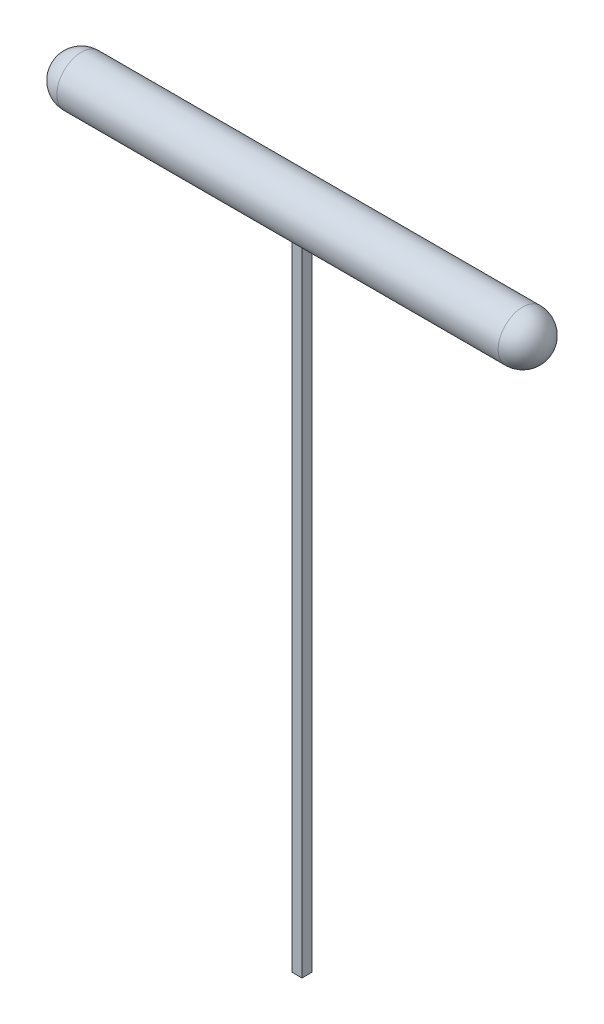
ISO-10303-21;
HEADER;
FILE_DESCRIPTION(('STEP AP214'),'2;1');
FILE_NAME('part.step','',(''),(''),'','','');
FILE_SCHEMA(('AUTOMOTIVE_DESIGN { 1 0 10303 214 1 1 1 1 }'));
ENDSEC;
DATA;
#1=APPLICATION_CONTEXT('core data for automotive mechanical design processes');
#2=APPLICATION_PROTOCOL_DEFINITION('international standard','automotive_design',2000,#1);
#3=PRODUCT_CONTEXT('',#1,'mechanical');
#4=PRODUCT('Part','Part','',(#3));
#5=PRODUCT_RELATED_PRODUCT_CATEGORY('part','',(#4));
#6=PRODUCT_DEFINITION_FORMATION('','',#4);
#7=PRODUCT_DEFINITION_CONTEXT('part definition',#1,'design');
#8=PRODUCT_DEFINITION('design','',#6,#7);
#9=PRODUCT_DEFINITION_SHAPE('','',#8);
#10=(LENGTH_UNIT() NAMED_UNIT(*) SI_UNIT(.MILLI.,.METRE.));
#11=(NAMED_UNIT(*) PLANE_ANGLE_UNIT() SI_UNIT($,.RADIAN.));
#12=(NAMED_UNIT(*) SI_UNIT($,.STERADIAN.) SOLID_ANGLE_UNIT());
#13=UNCERTAINTY_MEASURE_WITH_UNIT(LENGTH_MEASURE(1.E-05),#10,'distance_accuracy_value','');
#14=(GEOMETRIC_REPRESENTATION_CONTEXT(3) GLOBAL_UNCERTAINTY_ASSIGNED_CONTEXT((#13)) GLOBAL_UNIT_ASSIGNED_CONTEXT((#10,
#11,#12)) REPRESENTATION_CONTEXT('',''));
#15=CARTESIAN_POINT('',(0.,0.,0.));
#16=DIRECTION('',(0.,0.,1.));
#17=DIRECTION('',(1.,0.,0.));
#18=AXIS2_PLACEMENT_3D('',#15,#16,#17);
#19=CARTESIAN_POINT('',(0.500000000000008,0.,0.5));
#20=DIRECTION('',(1.,0.,0.));
#21=DIRECTION('',(0.,1.,0.));
#22=AXIS2_PLACEMENT_3D('',#19,#20,#21);
#23=PLANE('',#22);
#24=DIRECTION('',(0.,-1.,0.));
#25=VECTOR('',#24,1.);
#26=CARTESIAN_POINT('',(0.500000000000008,0.,-0.5));
#27=LINE('',#26,#25);
#28=CARTESIAN_POINT('',(0.500000000000007,-2.5,-0.5));
#29=VERTEX_POINT('',#28);
#30=CARTESIAN_POINT('',(0.500000000000001,-67.5,-0.5));
#31=VERTEX_POINT('',#30);
#32=EDGE_CURVE('E114',#29,#31,#27,.T.);
#33=ORIENTED_EDGE('',*,*,#32,.F.);
#34=DIRECTION('',(0.,0.,-1.));
#35=VECTOR('',#34,1.);
#36=CARTESIAN_POINT('',(0.500000000000007,-2.5,0.5));
#37=LINE('',#36,#35);
#38=CARTESIAN_POINT('',(0.500000000000007,-2.5,0.5));
#39=VERTEX_POINT('',#38);
#40=EDGE_CURVE('E12',#39,#29,#37,.T.);
#41=ORIENTED_EDGE('',*,*,#40,.F.);
#42=DIRECTION('',(0.,-1.,0.));
#43=VECTOR('',#42,1.);
#44=CARTESIAN_POINT('',(0.500000000000008,0.,0.5));
#45=LINE('',#44,#43);
#46=CARTESIAN_POINT('',(0.500000000000001,-67.5,0.5));
#47=VERTEX_POINT('',#46);
#48=EDGE_CURVE('E106',#39,#47,#45,.T.);
#49=ORIENTED_EDGE('',*,*,#48,.T.);
#50=DIRECTION('',(0.,0.,-1.));
#51=VECTOR('',#50,1.);
#52=CARTESIAN_POINT('',(0.500000000000001,-67.5,0.5));
#53=LINE('',#52,#51);
#54=EDGE_CURVE('E87',#47,#31,#53,.T.);
#55=ORIENTED_EDGE('',*,*,#54,.T.);
#56=EDGE_LOOP('',(#33,#41,#49,#55));
#57=FACE_BOUND('',#56,.T.);
#58=ADVANCED_FACE('F51',(#57),#23,.T.);
#59=CARTESIAN_POINT('',(0.,-2.5,0.5));
#60=DIRECTION('',(0.,1.,0.));
#61=DIRECTION('',(0.,0.,1.));
#62=AXIS2_PLACEMENT_3D('',#59,#60,#61);
#63=PLANE('',#62);
#64=DIRECTION('',(1.,0.,0.));
#65=VECTOR('',#64,1.);
#66=CARTESIAN_POINT('',(0.,-2.5,-0.5));
#67=LINE('',#66,#65);
#68=CARTESIAN_POINT('',(-0.500000000000007,-2.5,-0.5));
#69=VERTEX_POINT('',#68);
#70=EDGE_CURVE('E105',#69,#29,#67,.T.);
#71=ORIENTED_EDGE('',*,*,#70,.F.);
#72=DIRECTION('',(0.,0.,-1.));
#73=VECTOR('',#72,1.);
#74=CARTESIAN_POINT('',(-0.500000000000007,-2.5,0.5));
#75=LINE('',#74,#73);
#76=CARTESIAN_POINT('',(-0.500000000000007,-2.5,0.5));
#77=VERTEX_POINT('',#76);
#78=EDGE_CURVE('E56',#77,#69,#75,.T.);
#79=ORIENTED_EDGE('',*,*,#78,.F.);
#80=DIRECTION('',(1.,0.,0.));
#81=VECTOR('',#80,1.);
#82=CARTESIAN_POINT('',(0.,-2.5,0.5));
#83=LINE('',#82,#81);
#84=EDGE_CURVE('E99',#77,#39,#83,.T.);
#85=ORIENTED_EDGE('',*,*,#84,.T.);
#86=ORIENTED_EDGE('',*,*,#40,.T.);
#87=EDGE_LOOP('',(#71,#79,#85,#86));
#88=FACE_BOUND('',#87,.T.);
#89=ADVANCED_FACE('F97',(#88),#63,.T.);
#90=CARTESIAN_POINT('',(-0.500000000000008,0.,0.5));
#91=DIRECTION('',(1.,0.,0.));
#92=DIRECTION('',(0.,1.,0.));
#93=AXIS2_PLACEMENT_3D('',#90,#91,#92);
#94=PLANE('',#93);
#95=DIRECTION('',(0.,-1.,0.));
#96=VECTOR('',#95,1.);
#97=CARTESIAN_POINT('',(-0.500000000000008,0.,-0.5));
#98=LINE('',#97,#96);
#99=CARTESIAN_POINT('',(-0.499999999999998,-67.5,-0.5));
#100=VERTEX_POINT('',#99);
#101=EDGE_CURVE('E85',#69,#100,#98,.T.);
#102=ORIENTED_EDGE('',*,*,#101,.T.);
#103=DIRECTION('',(0.,0.,-1.));
#104=VECTOR('',#103,1.);
#105=CARTESIAN_POINT('',(-0.499999999999998,-67.5,0.5));
#106=LINE('',#105,#104);
#107=CARTESIAN_POINT('',(-0.499999999999998,-67.5,0.5));
#108=VERTEX_POINT('',#107);
#109=EDGE_CURVE('E104',#108,#100,#106,.T.);
#110=ORIENTED_EDGE('',*,*,#109,.F.);
#111=DIRECTION('',(0.,-1.,0.));
#112=VECTOR('',#111,1.);
#113=CARTESIAN_POINT('',(-0.500000000000008,0.,0.5));
#114=LINE('',#113,#112);
#115=EDGE_CURVE('E101',#77,#108,#114,.T.);
#116=ORIENTED_EDGE('',*,*,#115,.F.);
#117=ORIENTED_EDGE('',*,*,#78,.T.);
#118=EDGE_LOOP('',(#102,#110,#116,#117));
#119=FACE_BOUND('',#118,.T.);
#120=ADVANCED_FACE('F103',(#119),#94,.F.);
#121=CARTESIAN_POINT('',(0.,-67.5,0.5));
#122=DIRECTION('',(0.,1.,0.));
#123=DIRECTION('',(0.,0.,1.));
#124=AXIS2_PLACEMENT_3D('',#121,#122,#123);
#125=PLANE('',#124);
#126=DIRECTION('',(1.,0.,0.));
#127=VECTOR('',#126,1.);
#128=CARTESIAN_POINT('',(0.,-67.5,-0.5));
#129=LINE('',#128,#127);
#130=EDGE_CURVE('E109',#100,#31,#129,.T.);
#131=ORIENTED_EDGE('',*,*,#130,.T.);
#132=ORIENTED_EDGE('',*,*,#54,.F.);
#133=DIRECTION('',(1.,0.,0.));
#134=VECTOR('',#133,1.);
#135=CARTESIAN_POINT('',(0.,-67.5,0.5));
#136=LINE('',#135,#134);
#137=EDGE_CURVE('E70',#108,#47,#136,.T.);
#138=ORIENTED_EDGE('',*,*,#137,.F.);
#139=ORIENTED_EDGE('',*,*,#109,.T.);
#140=EDGE_LOOP('',(#131,#132,#138,#139));
#141=FACE_BOUND('',#140,.T.);
#142=ADVANCED_FACE('F121',(#141),#125,.F.);
#143=CARTESIAN_POINT('',(0.,0.,0.5));
#144=DIRECTION('',(0.,0.,1.));
#145=DIRECTION('',(1.,0.,0.));
#146=AXIS2_PLACEMENT_3D('',#143,#144,#145);
#147=PLANE('',#146);
#148=ORIENTED_EDGE('',*,*,#48,.F.);
#149=ORIENTED_EDGE('',*,*,#84,.F.);
#150=ORIENTED_EDGE('',*,*,#115,.T.);
#151=ORIENTED_EDGE('',*,*,#137,.T.);
#152=EDGE_LOOP('',(#148,#149,#150,#151));
#153=FACE_BOUND('',#152,.T.);
#154=ADVANCED_FACE('F110',(#153),#147,.T.);
#155=CARTESIAN_POINT('',(0.,0.,-0.5));
#156=DIRECTION('',(0.,0.,1.));
#157=DIRECTION('',(1.,0.,0.));
#158=AXIS2_PLACEMENT_3D('',#155,#156,#157);
#159=PLANE('',#158);
#160=ORIENTED_EDGE('',*,*,#32,.T.);
#161=ORIENTED_EDGE('',*,*,#130,.F.);
#162=ORIENTED_EDGE('',*,*,#101,.F.);
#163=ORIENTED_EDGE('',*,*,#70,.T.);
#164=EDGE_LOOP('',(#160,#161,#162,#163));
#165=FACE_BOUND('',#164,.T.);
#166=ADVANCED_FACE('F124',(#165),#159,.F.);
#167=CLOSED_SHELL('',(#58,#89,#120,#142,#154,#166));
#168=MANIFOLD_SOLID_BREP('B2',#167);
#169=CARTESIAN_POINT('',(22.5,0.,0.));
#170=DIRECTION('',(-1.,0.,0.));
#171=DIRECTION('',(0.,1.,0.));
#172=AXIS2_PLACEMENT_3D('',#169,#170,#171);
#173=SPHERICAL_SURFACE('',#172,2.5);
#174=CARTESIAN_POINT('',(22.5,0.,0.));
#175=DIRECTION('',(-1.,0.,0.));
#176=DIRECTION('',(0.,-1.,0.));
#177=AXIS2_PLACEMENT_3D('',#174,#175,#176);
#178=CIRCLE('',#177,2.5);
#179=CARTESIAN_POINT('',(22.5,-2.5,0.));
#180=VERTEX_POINT('',#179);
#181=EDGE_CURVE('E49',#180,#180,#178,.T.);
#182=ORIENTED_EDGE('',*,*,#181,.F.);
#183=EDGE_LOOP('',(#182));
#184=FACE_BOUND('',#183,.T.);
#185=ADVANCED_FACE('F178',(#184),#173,.T.);
#186=CARTESIAN_POINT('',(-25.,0.,0.));
#187=DIRECTION('',(-1.,0.,0.));
#188=DIRECTION('',(0.,-1.,0.));
#189=AXIS2_PLACEMENT_3D('',#186,#187,#188);
#190=CYLINDRICAL_SURFACE('',#189,2.5);
#191=ORIENTED_EDGE('',*,*,#181,.T.);
#192=EDGE_LOOP('',(#191));
#193=FACE_BOUND('',#192,.T.);
#194=CARTESIAN_POINT('',(-22.5,0.,0.));
#195=DIRECTION('',(-1.,0.,0.));
#196=DIRECTION('',(0.,-1.,0.));
#197=AXIS2_PLACEMENT_3D('',#194,#195,#196);
#198=CIRCLE('',#197,2.5);
#199=CARTESIAN_POINT('',(-22.5,-2.5,0.));
#200=VERTEX_POINT('',#199);
#201=EDGE_CURVE('E182',#200,#200,#198,.T.);
#202=ORIENTED_EDGE('',*,*,#201,.F.);
#203=EDGE_LOOP('',(#202));
#204=FACE_BOUND('',#203,.T.);
#205=ADVANCED_FACE('F195',(#193,#204),#190,.T.);
#206=CARTESIAN_POINT('',(-22.5,0.,0.));
#207=DIRECTION('',(-1.,0.,0.));
#208=DIRECTION('',(0.,1.,0.));
#209=AXIS2_PLACEMENT_3D('',#206,#207,#208);
#210=SPHERICAL_SURFACE('',#209,2.5);
#211=ORIENTED_EDGE('',*,*,#201,.T.);
#212=EDGE_LOOP('',(#211));
#213=FACE_BOUND('',#212,.T.);
#214=ADVANCED_FACE('F189',(#213),#210,.T.);
#215=CLOSED_SHELL('',(#185,#205,#214));
#216=MANIFOLD_SOLID_BREP('B6',#215);
#217=ADVANCED_BREP_SHAPE_REPRESENTATION('',(#18,#168,#216),#14);
#218=SHAPE_DEFINITION_REPRESENTATION(#9,#217);
ENDSEC;
END-ISO-10303-21;
